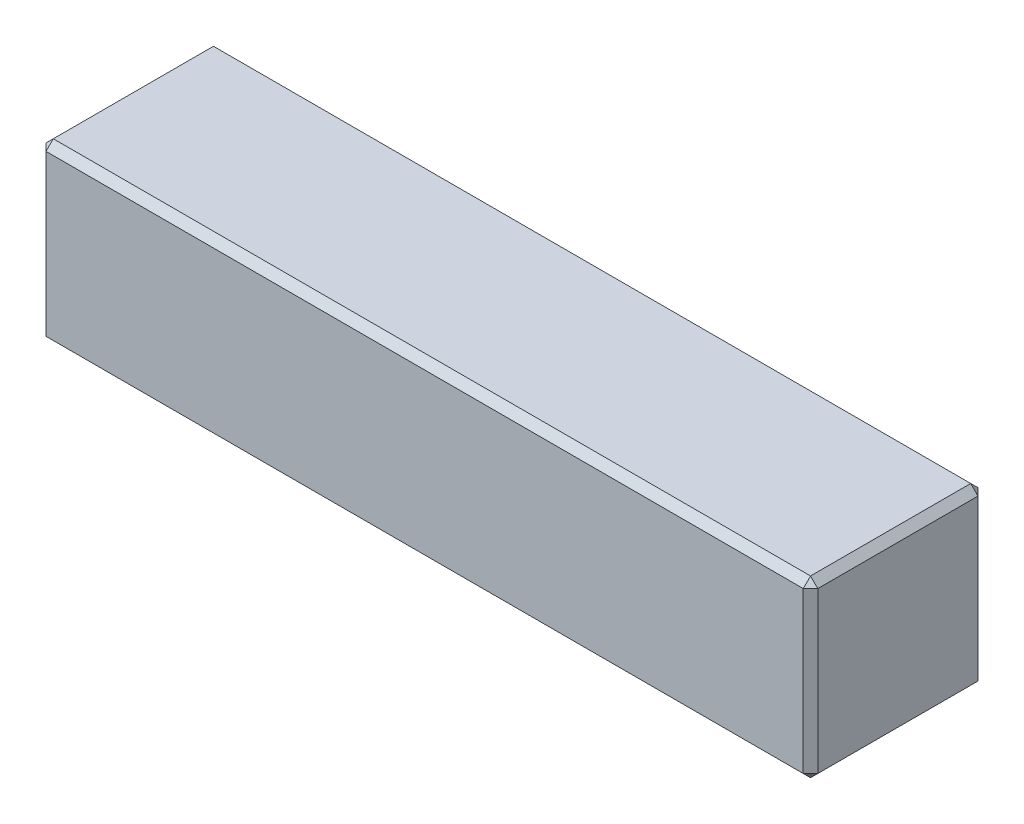
ISO-10303-21;
HEADER;
FILE_DESCRIPTION(('STEP AP214'),'2;1');
FILE_NAME('part.step','',(''),(''),'','','');
FILE_SCHEMA(('AUTOMOTIVE_DESIGN { 1 0 10303 214 1 1 1 1 }'));
ENDSEC;
DATA;
#1=APPLICATION_CONTEXT('core data for automotive mechanical design processes');
#2=APPLICATION_PROTOCOL_DEFINITION('international standard','automotive_design',2000,#1);
#3=PRODUCT_CONTEXT('',#1,'mechanical');
#4=PRODUCT('Part','Part','',(#3));
#5=PRODUCT_RELATED_PRODUCT_CATEGORY('part','',(#4));
#6=PRODUCT_DEFINITION_FORMATION('','',#4);
#7=PRODUCT_DEFINITION_CONTEXT('part definition',#1,'design');
#8=PRODUCT_DEFINITION('design','',#6,#7);
#9=PRODUCT_DEFINITION_SHAPE('','',#8);
#10=(LENGTH_UNIT() NAMED_UNIT(*) SI_UNIT(.MILLI.,.METRE.));
#11=(NAMED_UNIT(*) PLANE_ANGLE_UNIT() SI_UNIT($,.RADIAN.));
#12=(NAMED_UNIT(*) SI_UNIT($,.STERADIAN.) SOLID_ANGLE_UNIT());
#13=UNCERTAINTY_MEASURE_WITH_UNIT(LENGTH_MEASURE(1.E-05),#10,'distance_accuracy_value','');
#14=(GEOMETRIC_REPRESENTATION_CONTEXT(3) GLOBAL_UNCERTAINTY_ASSIGNED_CONTEXT((#13)) GLOBAL_UNIT_ASSIGNED_CONTEXT((#10,
#11,#12)) REPRESENTATION_CONTEXT('',''));
#15=CARTESIAN_POINT('',(0.,0.,0.));
#16=DIRECTION('',(0.,0.,1.));
#17=DIRECTION('',(1.,0.,0.));
#18=AXIS2_PLACEMENT_3D('',#15,#16,#17);
#19=CARTESIAN_POINT('',(26.5,-6.,-12.));
#20=DIRECTION('',(-1.,0.,0.));
#21=DIRECTION('',(0.,0.,1.));
#22=AXIS2_PLACEMENT_3D('',#19,#20,#21);
#23=PLANE('',#22);
#24=DIRECTION('',(0.,1.,0.));
#25=VECTOR('',#24,1.);
#26=CARTESIAN_POINT('',(26.5,-6.,-11.5));
#27=LINE('',#26,#25);
#28=CARTESIAN_POINT('',(26.5,-5.5,-11.5));
#29=VERTEX_POINT('',#28);
#30=CARTESIAN_POINT('',(26.5,5.5,-11.5));
#31=VERTEX_POINT('',#30);
#32=EDGE_CURVE('E140',#29,#31,#27,.T.);
#33=ORIENTED_EDGE('',*,*,#32,.T.);
#34=DIRECTION('',(0.,0.,1.));
#35=VECTOR('',#34,1.);
#36=CARTESIAN_POINT('',(26.5,5.5,-12.));
#37=LINE('',#36,#35);
#38=CARTESIAN_POINT('',(26.5,5.5,-0.5));
#39=VERTEX_POINT('',#38);
#40=EDGE_CURVE('E113',#31,#39,#37,.T.);
#41=ORIENTED_EDGE('',*,*,#40,.T.);
#42=DIRECTION('',(0.,-1.,0.));
#43=VECTOR('',#42,1.);
#44=CARTESIAN_POINT('',(26.5,-6.,-0.5));
#45=LINE('',#44,#43);
#46=CARTESIAN_POINT('',(26.5,-5.5,-0.5));
#47=VERTEX_POINT('',#46);
#48=EDGE_CURVE('E131',#39,#47,#45,.T.);
#49=ORIENTED_EDGE('',*,*,#48,.T.);
#50=DIRECTION('',(0.,0.,-1.));
#51=VECTOR('',#50,1.);
#52=CARTESIAN_POINT('',(26.5,-5.5,-12.));
#53=LINE('',#52,#51);
#54=EDGE_CURVE('E137',#47,#29,#53,.T.);
#55=ORIENTED_EDGE('',*,*,#54,.T.);
#56=EDGE_LOOP('',(#33,#41,#49,#55));
#57=FACE_BOUND('',#56,.T.);
#58=ADVANCED_FACE('F16',(#57),#23,.F.);
#59=CARTESIAN_POINT('',(26.5,-6.,-12.));
#60=DIRECTION('',(0.,1.,0.));
#61=DIRECTION('',(0.,0.,1.));
#62=AXIS2_PLACEMENT_3D('',#59,#60,#61);
#63=PLANE('',#62);
#64=DIRECTION('',(-1.,0.,0.));
#65=VECTOR('',#64,1.);
#66=CARTESIAN_POINT('',(-26.5,-6.,-0.5));
#67=LINE('',#66,#65);
#68=CARTESIAN_POINT('',(26.,-6.,-0.5));
#69=VERTEX_POINT('',#68);
#70=CARTESIAN_POINT('',(-26.,-6.,-0.5));
#71=VERTEX_POINT('',#70);
#72=EDGE_CURVE('E162',#69,#71,#67,.T.);
#73=ORIENTED_EDGE('',*,*,#72,.T.);
#74=DIRECTION('',(0.,0.,-1.));
#75=VECTOR('',#74,1.);
#76=CARTESIAN_POINT('',(-26.,-6.,-12.));
#77=LINE('',#76,#75);
#78=CARTESIAN_POINT('',(-26.,-6.,-11.5));
#79=VERTEX_POINT('',#78);
#80=EDGE_CURVE('E168',#71,#79,#77,.T.);
#81=ORIENTED_EDGE('',*,*,#80,.T.);
#82=DIRECTION('',(1.,0.,0.));
#83=VECTOR('',#82,1.);
#84=CARTESIAN_POINT('',(26.5,-6.,-11.5));
#85=LINE('',#84,#83);
#86=CARTESIAN_POINT('',(26.,-6.,-11.5));
#87=VERTEX_POINT('',#86);
#88=EDGE_CURVE('E166',#79,#87,#85,.T.);
#89=ORIENTED_EDGE('',*,*,#88,.T.);
#90=DIRECTION('',(0.,0.,1.));
#91=VECTOR('',#90,1.);
#92=CARTESIAN_POINT('',(26.,-6.,-12.));
#93=LINE('',#92,#91);
#94=EDGE_CURVE('E164',#87,#69,#93,.T.);
#95=ORIENTED_EDGE('',*,*,#94,.T.);
#96=EDGE_LOOP('',(#73,#81,#89,#95));
#97=FACE_BOUND('',#96,.T.);
#98=ADVANCED_FACE('F262',(#97),#63,.F.);
#99=CARTESIAN_POINT('',(-26.5,-6.,-12.));
#100=DIRECTION('',(1.,0.,0.));
#101=DIRECTION('',(0.,1.,0.));
#102=AXIS2_PLACEMENT_3D('',#99,#100,#101);
#103=PLANE('',#102);
#104=DIRECTION('',(0.,0.,-1.));
#105=VECTOR('',#104,1.);
#106=CARTESIAN_POINT('',(-26.5,5.5,-12.));
#107=LINE('',#106,#105);
#108=CARTESIAN_POINT('',(-26.5,5.5,-0.5));
#109=VERTEX_POINT('',#108);
#110=CARTESIAN_POINT('',(-26.5,5.5,-11.5));
#111=VERTEX_POINT('',#110);
#112=EDGE_CURVE('E157',#109,#111,#107,.T.);
#113=ORIENTED_EDGE('',*,*,#112,.T.);
#114=DIRECTION('',(0.,-1.,0.));
#115=VECTOR('',#114,1.);
#116=CARTESIAN_POINT('',(-26.5,-6.,-11.5));
#117=LINE('',#116,#115);
#118=CARTESIAN_POINT('',(-26.5,-5.5,-11.5));
#119=VERTEX_POINT('',#118);
#120=EDGE_CURVE('E160',#111,#119,#117,.T.);
#121=ORIENTED_EDGE('',*,*,#120,.T.);
#122=DIRECTION('',(0.,0.,1.));
#123=VECTOR('',#122,1.);
#124=CARTESIAN_POINT('',(-26.5,-5.5,-12.));
#125=LINE('',#124,#123);
#126=CARTESIAN_POINT('',(-26.5,-5.5,-0.5));
#127=VERTEX_POINT('',#126);
#128=EDGE_CURVE('E155',#119,#127,#125,.T.);
#129=ORIENTED_EDGE('',*,*,#128,.T.);
#130=DIRECTION('',(0.,1.,0.));
#131=VECTOR('',#130,1.);
#132=CARTESIAN_POINT('',(-26.5,6.,-0.5));
#133=LINE('',#132,#131);
#134=EDGE_CURVE('E153',#127,#109,#133,.T.);
#135=ORIENTED_EDGE('',*,*,#134,.T.);
#136=EDGE_LOOP('',(#113,#121,#129,#135));
#137=FACE_BOUND('',#136,.T.);
#138=ADVANCED_FACE('F282',(#137),#103,.F.);
#139=CARTESIAN_POINT('',(26.5,6.,-12.));
#140=DIRECTION('',(0.,-1.,0.));
#141=DIRECTION('',(0.,0.,-1.));
#142=AXIS2_PLACEMENT_3D('',#139,#140,#141);
#143=PLANE('',#142);
#144=DIRECTION('',(0.,0.,-1.));
#145=VECTOR('',#144,1.);
#146=CARTESIAN_POINT('',(26.,6.,-12.));
#147=LINE('',#146,#145);
#148=CARTESIAN_POINT('',(26.,6.,-0.5));
#149=VERTEX_POINT('',#148);
#150=CARTESIAN_POINT('',(26.,6.,-11.5));
#151=VERTEX_POINT('',#150);
#152=EDGE_CURVE('E115',#149,#151,#147,.T.);
#153=ORIENTED_EDGE('',*,*,#152,.T.);
#154=DIRECTION('',(-1.,0.,0.));
#155=VECTOR('',#154,1.);
#156=CARTESIAN_POINT('',(26.5,6.,-11.5));
#157=LINE('',#156,#155);
#158=CARTESIAN_POINT('',(-26.,6.,-11.5));
#159=VERTEX_POINT('',#158);
#160=EDGE_CURVE('E151',#151,#159,#157,.T.);
#161=ORIENTED_EDGE('',*,*,#160,.T.);
#162=DIRECTION('',(0.,0.,1.));
#163=VECTOR('',#162,1.);
#164=CARTESIAN_POINT('',(-26.,6.,-12.));
#165=LINE('',#164,#163);
#166=CARTESIAN_POINT('',(-26.,6.,-0.5));
#167=VERTEX_POINT('',#166);
#168=EDGE_CURVE('E144',#159,#167,#165,.T.);
#169=ORIENTED_EDGE('',*,*,#168,.T.);
#170=DIRECTION('',(1.,0.,0.));
#171=VECTOR('',#170,1.);
#172=CARTESIAN_POINT('',(26.5,6.,-0.5));
#173=LINE('',#172,#171);
#174=EDGE_CURVE('E142',#167,#149,#173,.T.);
#175=ORIENTED_EDGE('',*,*,#174,.T.);
#176=EDGE_LOOP('',(#153,#161,#169,#175));
#177=FACE_BOUND('',#176,.T.);
#178=ADVANCED_FACE('F339',(#177),#143,.F.);
#179=CARTESIAN_POINT('',(26.5,6.,-12.));
#180=DIRECTION('',(0.,0.,1.));
#181=DIRECTION('',(1.,0.,0.));
#182=AXIS2_PLACEMENT_3D('',#179,#180,#181);
#183=PLANE('',#182);
#184=DIRECTION('',(0.,1.,0.));
#185=VECTOR('',#184,1.);
#186=CARTESIAN_POINT('',(-26.,6.00000000000002,-12.));
#187=LINE('',#186,#185);
#188=CARTESIAN_POINT('',(-26.,-5.5,-12.));
#189=VERTEX_POINT('',#188);
#190=CARTESIAN_POINT('',(-26.,5.5,-12.));
#191=VERTEX_POINT('',#190);
#192=EDGE_CURVE('E175',#189,#191,#187,.T.);
#193=ORIENTED_EDGE('',*,*,#192,.T.);
#194=DIRECTION('',(1.,0.,0.));
#195=VECTOR('',#194,1.);
#196=CARTESIAN_POINT('',(26.5,5.5,-12.));
#197=LINE('',#196,#195);
#198=CARTESIAN_POINT('',(26.,5.5,-12.));
#199=VERTEX_POINT('',#198);
#200=EDGE_CURVE('E177',#191,#199,#197,.T.);
#201=ORIENTED_EDGE('',*,*,#200,.T.);
#202=DIRECTION('',(0.,-1.,0.));
#203=VECTOR('',#202,1.);
#204=CARTESIAN_POINT('',(26.,6.,-12.));
#205=LINE('',#204,#203);
#206=CARTESIAN_POINT('',(26.,-5.5,-12.));
#207=VERTEX_POINT('',#206);
#208=EDGE_CURVE('E171',#199,#207,#205,.T.);
#209=ORIENTED_EDGE('',*,*,#208,.T.);
#210=DIRECTION('',(-1.,0.,0.));
#211=VECTOR('',#210,1.);
#212=CARTESIAN_POINT('',(26.5,-5.5,-12.));
#213=LINE('',#212,#211);
#214=EDGE_CURVE('E173',#207,#189,#213,.T.);
#215=ORIENTED_EDGE('',*,*,#214,.T.);
#216=EDGE_LOOP('',(#193,#201,#209,#215));
#217=FACE_BOUND('',#216,.T.);
#218=ADVANCED_FACE('F253',(#217),#183,.F.);
#219=CARTESIAN_POINT('',(26.5,6.,0.));
#220=DIRECTION('',(0.,0.,1.));
#221=DIRECTION('',(1.,0.,0.));
#222=AXIS2_PLACEMENT_3D('',#219,#220,#221);
#223=PLANE('',#222);
#224=DIRECTION('',(0.,1.,0.));
#225=VECTOR('',#224,1.);
#226=CARTESIAN_POINT('',(26.,6.,0.));
#227=LINE('',#226,#225);
#228=CARTESIAN_POINT('',(26.,-5.5,0.));
#229=VERTEX_POINT('',#228);
#230=CARTESIAN_POINT('',(26.,5.5,0.));
#231=VERTEX_POINT('',#230);
#232=EDGE_CURVE('E180',#229,#231,#227,.T.);
#233=ORIENTED_EDGE('',*,*,#232,.T.);
#234=DIRECTION('',(-1.,0.,0.));
#235=VECTOR('',#234,1.);
#236=CARTESIAN_POINT('',(-26.5,5.5,0.));
#237=LINE('',#236,#235);
#238=CARTESIAN_POINT('',(-26.,5.5,0.));
#239=VERTEX_POINT('',#238);
#240=EDGE_CURVE('E10',#231,#239,#237,.T.);
#241=ORIENTED_EDGE('',*,*,#240,.T.);
#242=DIRECTION('',(0.,-1.,0.));
#243=VECTOR('',#242,1.);
#244=CARTESIAN_POINT('',(-26.,-6.,0.));
#245=LINE('',#244,#243);
#246=CARTESIAN_POINT('',(-26.,-5.5,0.));
#247=VERTEX_POINT('',#246);
#248=EDGE_CURVE('E25',#239,#247,#245,.T.);
#249=ORIENTED_EDGE('',*,*,#248,.T.);
#250=DIRECTION('',(1.,0.,0.));
#251=VECTOR('',#250,1.);
#252=CARTESIAN_POINT('',(26.5,-5.5,0.));
#253=LINE('',#252,#251);
#254=EDGE_CURVE('E182',#247,#229,#253,.T.);
#255=ORIENTED_EDGE('',*,*,#254,.T.);
#256=EDGE_LOOP('',(#233,#241,#249,#255));
#257=FACE_BOUND('',#256,.T.);
#258=ADVANCED_FACE('F346',(#257),#223,.T.);
#259=CARTESIAN_POINT('',(-26.5,-5.5,-12.));
#260=DIRECTION('',(0.70710678118655,0.707106781186545,0.));
#261=DIRECTION('',(0.,0.,1.));
#262=AXIS2_PLACEMENT_3D('',#259,#260,#261);
#263=PLANE('',#262);
#264=DIRECTION('',(0.707106781186545,-0.70710678118655,0.));
#265=VECTOR('',#264,1.);
#266=CARTESIAN_POINT('',(-26.,-6.,-11.5));
#267=LINE('',#266,#265);
#268=EDGE_CURVE('E20',#79,#119,#267,.F.);
#269=ORIENTED_EDGE('',*,*,#268,.F.);
#270=ORIENTED_EDGE('',*,*,#80,.F.);
#271=DIRECTION('',(-0.707106781186545,0.70710678118655,0.));
#272=VECTOR('',#271,1.);
#273=CARTESIAN_POINT('',(-26.5,-5.5,-0.5));
#274=LINE('',#273,#272);
#275=EDGE_CURVE('E231',#127,#71,#274,.F.);
#276=ORIENTED_EDGE('',*,*,#275,.F.);
#277=ORIENTED_EDGE('',*,*,#128,.F.);
#278=EDGE_LOOP('',(#269,#270,#276,#277));
#279=FACE_BOUND('',#278,.T.);
#280=ADVANCED_FACE('F18',(#279),#263,.F.);
#281=CARTESIAN_POINT('',(-26.,-6.,-11.5));
#282=DIRECTION('',(-0.577350269189624,-0.57735026918962,-0.577350269189632));
#283=DIRECTION('',(-0.707106781186552,0.,0.707106781186543));
#284=AXIS2_PLACEMENT_3D('',#281,#282,#283);
#285=PLANE('',#284);
#286=DIRECTION('',(0.,0.707106781186547,-0.707106781186547));
#287=VECTOR('',#286,1.);
#288=CARTESIAN_POINT('',(-26.,-6.,-11.5));
#289=LINE('',#288,#287);
#290=EDGE_CURVE('E226',#79,#189,#289,.T.);
#291=ORIENTED_EDGE('',*,*,#290,.F.);
#292=ORIENTED_EDGE('',*,*,#268,.T.);
#293=DIRECTION('',(-0.707106781186552,0.,0.707106781186542));
#294=VECTOR('',#293,1.);
#295=CARTESIAN_POINT('',(-26.25,-5.5,-11.75));
#296=LINE('',#295,#294);
#297=EDGE_CURVE('E229',#189,#119,#296,.T.);
#298=ORIENTED_EDGE('',*,*,#297,.F.);
#299=EDGE_LOOP('',(#291,#292,#298));
#300=FACE_BOUND('',#299,.T.);
#301=ADVANCED_FACE('F242',(#300),#285,.T.);
#302=CARTESIAN_POINT('',(-26.5,-5.5,-0.5));
#303=DIRECTION('',(-0.577350269189624,-0.57735026918962,0.577350269189632));
#304=DIRECTION('',(0.707106781186552,0.,0.707106781186543));
#305=AXIS2_PLACEMENT_3D('',#302,#303,#304);
#306=PLANE('',#305);
#307=DIRECTION('',(-0.707106781186552,0.,-0.707106781186542));
#308=VECTOR('',#307,1.);
#309=CARTESIAN_POINT('',(-26.5,-5.5,-0.500000000000001));
#310=LINE('',#309,#308);
#311=EDGE_CURVE('E221',#127,#247,#310,.F.);
#312=ORIENTED_EDGE('',*,*,#311,.F.);
#313=ORIENTED_EDGE('',*,*,#275,.T.);
#314=DIRECTION('',(0.,0.707106781186547,0.707106781186547));
#315=VECTOR('',#314,1.);
#316=CARTESIAN_POINT('',(-26.,-5.75,-0.250000000000005));
#317=LINE('',#316,#315);
#318=EDGE_CURVE('E223',#247,#71,#317,.F.);
#319=ORIENTED_EDGE('',*,*,#318,.F.);
#320=EDGE_LOOP('',(#312,#313,#319));
#321=FACE_BOUND('',#320,.T.);
#322=ADVANCED_FACE('F276',(#321),#306,.T.);
#323=CARTESIAN_POINT('',(-26.,6.00000000000002,-12.));
#324=DIRECTION('',(0.707106781186542,0.,0.707106781186552));
#325=DIRECTION('',(0.,1.,0.));
#326=AXIS2_PLACEMENT_3D('',#323,#324,#325);
#327=PLANE('',#326);
#328=ORIENTED_EDGE('',*,*,#297,.T.);
#329=ORIENTED_EDGE('',*,*,#120,.F.);
#330=DIRECTION('',(0.707106781186552,0.,-0.707106781186543));
#331=VECTOR('',#330,1.);
#332=CARTESIAN_POINT('',(-26.5,5.5,-11.5));
#333=LINE('',#332,#331);
#334=EDGE_CURVE('E216',#191,#111,#333,.F.);
#335=ORIENTED_EDGE('',*,*,#334,.F.);
#336=ORIENTED_EDGE('',*,*,#192,.F.);
#337=EDGE_LOOP('',(#328,#329,#335,#336));
#338=FACE_BOUND('',#337,.T.);
#339=ADVANCED_FACE('F249',(#338),#327,.F.);
#340=CARTESIAN_POINT('',(26.5,-5.5,-12.));
#341=DIRECTION('',(0.,0.707106781186547,0.707106781186547));
#342=DIRECTION('',(-1.,0.,0.));
#343=AXIS2_PLACEMENT_3D('',#340,#341,#342);
#344=PLANE('',#343);
#345=ORIENTED_EDGE('',*,*,#290,.T.);
#346=ORIENTED_EDGE('',*,*,#214,.F.);
#347=DIRECTION('',(0.,-0.707106781186547,0.707106781186547));
#348=VECTOR('',#347,1.);
#349=CARTESIAN_POINT('',(26.,-6.,-11.5));
#350=LINE('',#349,#348);
#351=EDGE_CURVE('E213',#87,#207,#350,.F.);
#352=ORIENTED_EDGE('',*,*,#351,.F.);
#353=ORIENTED_EDGE('',*,*,#88,.F.);
#354=EDGE_LOOP('',(#345,#346,#352,#353));
#355=FACE_BOUND('',#354,.T.);
#356=ADVANCED_FACE('F259',(#355),#344,.F.);
#357=CARTESIAN_POINT('',(26.,-6.,-12.));
#358=DIRECTION('',(-0.707106781186547,0.707106781186547,0.));
#359=DIRECTION('',(0.,0.,1.));
#360=AXIS2_PLACEMENT_3D('',#357,#358,#359);
#361=PLANE('',#360);
#362=DIRECTION('',(-0.707106781186547,-0.707106781186547,0.));
#363=VECTOR('',#362,1.);
#364=CARTESIAN_POINT('',(26.,-6.,-0.5));
#365=LINE('',#364,#363);
#366=EDGE_CURVE('E207',#69,#47,#365,.F.);
#367=ORIENTED_EDGE('',*,*,#366,.F.);
#368=ORIENTED_EDGE('',*,*,#94,.F.);
#369=DIRECTION('',(0.707106781186547,0.707106781186547,0.));
#370=VECTOR('',#369,1.);
#371=CARTESIAN_POINT('',(26.,-6.,-11.5));
#372=LINE('',#371,#370);
#373=EDGE_CURVE('E210',#29,#87,#372,.F.);
#374=ORIENTED_EDGE('',*,*,#373,.F.);
#375=ORIENTED_EDGE('',*,*,#54,.F.);
#376=EDGE_LOOP('',(#367,#368,#374,#375));
#377=FACE_BOUND('',#376,.T.);
#378=ADVANCED_FACE('F267',(#377),#361,.F.);
#379=CARTESIAN_POINT('',(26.5,-6.,-0.5));
#380=DIRECTION('',(0.,-0.707106781186547,0.707106781186547));
#381=DIRECTION('',(1.,0.,0.));
#382=AXIS2_PLACEMENT_3D('',#379,#380,#381);
#383=PLANE('',#382);
#384=ORIENTED_EDGE('',*,*,#318,.T.);
#385=ORIENTED_EDGE('',*,*,#72,.F.);
#386=DIRECTION('',(0.,-0.707106781186547,-0.707106781186547));
#387=VECTOR('',#386,1.);
#388=CARTESIAN_POINT('',(26.,-6.,-0.5));
#389=LINE('',#388,#387);
#390=EDGE_CURVE('E204',#229,#69,#389,.T.);
#391=ORIENTED_EDGE('',*,*,#390,.F.);
#392=ORIENTED_EDGE('',*,*,#254,.F.);
#393=EDGE_LOOP('',(#384,#385,#391,#392));
#394=FACE_BOUND('',#393,.T.);
#395=ADVANCED_FACE('F274',(#394),#383,.T.);
#396=CARTESIAN_POINT('',(-26.5,-6.,-0.5));
#397=DIRECTION('',(-0.707106781186542,0.,0.707106781186552));
#398=DIRECTION('',(0.,-1.,0.));
#399=AXIS2_PLACEMENT_3D('',#396,#397,#398);
#400=PLANE('',#399);
#401=ORIENTED_EDGE('',*,*,#311,.T.);
#402=ORIENTED_EDGE('',*,*,#248,.F.);
#403=DIRECTION('',(0.707106781186552,0.,0.707106781186543));
#404=VECTOR('',#403,1.);
#405=CARTESIAN_POINT('',(-26.25,5.5,-0.250000000000004));
#406=LINE('',#405,#404);
#407=EDGE_CURVE('E202',#109,#239,#406,.T.);
#408=ORIENTED_EDGE('',*,*,#407,.F.);
#409=ORIENTED_EDGE('',*,*,#134,.F.);
#410=EDGE_LOOP('',(#401,#402,#408,#409));
#411=FACE_BOUND('',#410,.T.);
#412=ADVANCED_FACE('F279',(#411),#400,.T.);
#413=CARTESIAN_POINT('',(-26.,6.,-12.));
#414=DIRECTION('',(0.707106781186552,-0.707106781186543,0.));
#415=DIRECTION('',(0.,0.,1.));
#416=AXIS2_PLACEMENT_3D('',#413,#414,#415);
#417=PLANE('',#416);
#418=DIRECTION('',(-0.707106781186543,-0.707106781186552,0.));
#419=VECTOR('',#418,1.);
#420=CARTESIAN_POINT('',(-26.5,5.5,-11.5));
#421=LINE('',#420,#419);
#422=EDGE_CURVE('E218',#111,#159,#421,.F.);
#423=ORIENTED_EDGE('',*,*,#422,.F.);
#424=ORIENTED_EDGE('',*,*,#112,.F.);
#425=DIRECTION('',(0.707106781186543,0.707106781186552,0.));
#426=VECTOR('',#425,1.);
#427=CARTESIAN_POINT('',(-26.,6.,-0.5));
#428=LINE('',#427,#426);
#429=EDGE_CURVE('E199',#167,#109,#428,.F.);
#430=ORIENTED_EDGE('',*,*,#429,.F.);
#431=ORIENTED_EDGE('',*,*,#168,.F.);
#432=EDGE_LOOP('',(#423,#424,#430,#431));
#433=FACE_BOUND('',#432,.T.);
#434=ADVANCED_FACE('F286',(#433),#417,.F.);
#435=CARTESIAN_POINT('',(-26.5,5.5,-11.5));
#436=DIRECTION('',(-0.577350269189626,0.577350269189618,-0.577350269189634));
#437=DIRECTION('',(-0.707106781186552,0.,0.707106781186543));
#438=AXIS2_PLACEMENT_3D('',#435,#436,#437);
#439=PLANE('',#438);
#440=ORIENTED_EDGE('',*,*,#334,.T.);
#441=ORIENTED_EDGE('',*,*,#422,.T.);
#442=DIRECTION('',(0.,0.707106781186548,0.707106781186548));
#443=VECTOR('',#442,1.);
#444=CARTESIAN_POINT('',(-26.,5.75000000000001,-11.75));
#445=LINE('',#444,#443);
#446=EDGE_CURVE('E196',#191,#159,#445,.T.);
#447=ORIENTED_EDGE('',*,*,#446,.F.);
#448=EDGE_LOOP('',(#440,#441,#447));
#449=FACE_BOUND('',#448,.T.);
#450=ADVANCED_FACE('F289',(#449),#439,.T.);
#451=CARTESIAN_POINT('',(26.,-6.,-11.5));
#452=DIRECTION('',(0.577350269189626,-0.577350269189626,-0.577350269189626));
#453=DIRECTION('',(-0.707106781186547,0.,-0.707106781186547));
#454=AXIS2_PLACEMENT_3D('',#451,#452,#453);
#455=PLANE('',#454);
#456=ORIENTED_EDGE('',*,*,#373,.T.);
#457=ORIENTED_EDGE('',*,*,#351,.T.);
#458=DIRECTION('',(-0.707106781186547,0.,-0.707106781186547));
#459=VECTOR('',#458,1.);
#460=CARTESIAN_POINT('',(26.25,-5.5,-11.75));
#461=LINE('',#460,#459);
#462=EDGE_CURVE('E193',#29,#207,#461,.T.);
#463=ORIENTED_EDGE('',*,*,#462,.F.);
#464=EDGE_LOOP('',(#456,#457,#463));
#465=FACE_BOUND('',#464,.T.);
#466=ADVANCED_FACE('F299',(#465),#455,.T.);
#467=CARTESIAN_POINT('',(26.,-6.,-0.5));
#468=DIRECTION('',(0.577350269189626,-0.577350269189626,0.577350269189626));
#469=DIRECTION('',(0.707106781186547,0.,-0.707106781186547));
#470=AXIS2_PLACEMENT_3D('',#467,#468,#469);
#471=PLANE('',#470);
#472=ORIENTED_EDGE('',*,*,#390,.T.);
#473=ORIENTED_EDGE('',*,*,#366,.T.);
#474=DIRECTION('',(-0.707106781186547,0.,0.707106781186547));
#475=VECTOR('',#474,1.);
#476=CARTESIAN_POINT('',(26.25,-5.5,-0.25));
#477=LINE('',#476,#475);
#478=EDGE_CURVE('E134',#229,#47,#477,.F.);
#479=ORIENTED_EDGE('',*,*,#478,.F.);
#480=EDGE_LOOP('',(#472,#473,#479));
#481=FACE_BOUND('',#480,.T.);
#482=ADVANCED_FACE('F271',(#481),#471,.T.);
#483=CARTESIAN_POINT('',(-26.,6.,-0.5));
#484=DIRECTION('',(-0.577350269189626,0.577350269189618,0.577350269189634));
#485=DIRECTION('',(0.707106781186552,0.,0.707106781186543));
#486=AXIS2_PLACEMENT_3D('',#483,#484,#485);
#487=PLANE('',#486);
#488=ORIENTED_EDGE('',*,*,#429,.T.);
#489=ORIENTED_EDGE('',*,*,#407,.T.);
#490=DIRECTION('',(0.,0.707106781186548,-0.707106781186548));
#491=VECTOR('',#490,1.);
#492=CARTESIAN_POINT('',(-26.,6.,-0.5));
#493=LINE('',#492,#491);
#494=EDGE_CURVE('E33',#167,#239,#493,.F.);
#495=ORIENTED_EDGE('',*,*,#494,.F.);
#496=EDGE_LOOP('',(#488,#489,#495));
#497=FACE_BOUND('',#496,.T.);
#498=ADVANCED_FACE('F307',(#497),#487,.T.);
#499=CARTESIAN_POINT('',(26.5,5.5,-12.));
#500=DIRECTION('',(0.,-0.707106781186547,0.707106781186547));
#501=DIRECTION('',(1.,0.,0.));
#502=AXIS2_PLACEMENT_3D('',#499,#500,#501);
#503=PLANE('',#502);
#504=ORIENTED_EDGE('',*,*,#446,.T.);
#505=ORIENTED_EDGE('',*,*,#160,.F.);
#506=DIRECTION('',(0.,-0.707106781186547,-0.707106781186547));
#507=VECTOR('',#506,1.);
#508=CARTESIAN_POINT('',(26.,6.,-11.5));
#509=LINE('',#508,#507);
#510=EDGE_CURVE('E188',#199,#151,#509,.F.);
#511=ORIENTED_EDGE('',*,*,#510,.F.);
#512=ORIENTED_EDGE('',*,*,#200,.F.);
#513=EDGE_LOOP('',(#504,#505,#511,#512));
#514=FACE_BOUND('',#513,.T.);
#515=ADVANCED_FACE('F292',(#514),#503,.F.);
#516=CARTESIAN_POINT('',(26.,6.,-12.));
#517=DIRECTION('',(-0.707106781186547,0.,0.707106781186547));
#518=DIRECTION('',(0.,-1.,0.));
#519=AXIS2_PLACEMENT_3D('',#516,#517,#518);
#520=PLANE('',#519);
#521=ORIENTED_EDGE('',*,*,#462,.T.);
#522=ORIENTED_EDGE('',*,*,#208,.F.);
#523=DIRECTION('',(0.707106781186547,0.,0.707106781186547));
#524=VECTOR('',#523,1.);
#525=CARTESIAN_POINT('',(26.25,5.5,-11.75));
#526=LINE('',#525,#524);
#527=EDGE_CURVE('E128',#31,#199,#526,.F.);
#528=ORIENTED_EDGE('',*,*,#527,.F.);
#529=ORIENTED_EDGE('',*,*,#32,.F.);
#530=EDGE_LOOP('',(#521,#522,#528,#529));
#531=FACE_BOUND('',#530,.T.);
#532=ADVANCED_FACE('F297',(#531),#520,.F.);
#533=CARTESIAN_POINT('',(26.5,-6.,-0.5));
#534=DIRECTION('',(0.707106781186547,0.,0.707106781186547));
#535=DIRECTION('',(0.,1.,0.));
#536=AXIS2_PLACEMENT_3D('',#533,#534,#535);
#537=PLANE('',#536);
#538=ORIENTED_EDGE('',*,*,#478,.T.);
#539=ORIENTED_EDGE('',*,*,#48,.F.);
#540=DIRECTION('',(0.707106781186547,0.,-0.707106781186547));
#541=VECTOR('',#540,1.);
#542=CARTESIAN_POINT('',(26.5,5.5,-0.5));
#543=LINE('',#542,#541);
#544=EDGE_CURVE('E121',#231,#39,#543,.T.);
#545=ORIENTED_EDGE('',*,*,#544,.F.);
#546=ORIENTED_EDGE('',*,*,#232,.F.);
#547=EDGE_LOOP('',(#538,#539,#545,#546));
#548=FACE_BOUND('',#547,.T.);
#549=ADVANCED_FACE('F132',(#548),#537,.T.);
#550=CARTESIAN_POINT('',(26.5,6.,-0.5));
#551=DIRECTION('',(0.,0.707106781186547,0.707106781186547));
#552=DIRECTION('',(-1.,0.,0.));
#553=AXIS2_PLACEMENT_3D('',#550,#551,#552);
#554=PLANE('',#553);
#555=ORIENTED_EDGE('',*,*,#494,.T.);
#556=ORIENTED_EDGE('',*,*,#240,.F.);
#557=DIRECTION('',(0.,-0.707106781186547,0.707106781186547));
#558=VECTOR('',#557,1.);
#559=CARTESIAN_POINT('',(26.,5.75,-0.25));
#560=LINE('',#559,#558);
#561=EDGE_CURVE('E125',#149,#231,#560,.T.);
#562=ORIENTED_EDGE('',*,*,#561,.F.);
#563=ORIENTED_EDGE('',*,*,#174,.F.);
#564=EDGE_LOOP('',(#555,#556,#562,#563));
#565=FACE_BOUND('',#564,.T.);
#566=ADVANCED_FACE('F325',(#565),#554,.T.);
#567=CARTESIAN_POINT('',(26.,6.,-11.5));
#568=DIRECTION('',(0.577350269189626,0.577350269189626,-0.577350269189626));
#569=DIRECTION('',(-0.707106781186547,0.,-0.707106781186547));
#570=AXIS2_PLACEMENT_3D('',#567,#568,#569);
#571=PLANE('',#570);
#572=ORIENTED_EDGE('',*,*,#527,.T.);
#573=ORIENTED_EDGE('',*,*,#510,.T.);
#574=DIRECTION('',(-0.707106781186547,0.707106781186547,0.));
#575=VECTOR('',#574,1.);
#576=CARTESIAN_POINT('',(26.,6.,-11.5));
#577=LINE('',#576,#575);
#578=EDGE_CURVE('E118',#31,#151,#577,.T.);
#579=ORIENTED_EDGE('',*,*,#578,.F.);
#580=EDGE_LOOP('',(#572,#573,#579));
#581=FACE_BOUND('',#580,.T.);
#582=ADVANCED_FACE('F322',(#581),#571,.T.);
#583=CARTESIAN_POINT('',(26.5,5.5,-0.5));
#584=DIRECTION('',(0.577350269189626,0.577350269189626,0.577350269189626));
#585=DIRECTION('',(0.707106781186547,0.,-0.707106781186547));
#586=AXIS2_PLACEMENT_3D('',#583,#584,#585);
#587=PLANE('',#586);
#588=ORIENTED_EDGE('',*,*,#561,.T.);
#589=ORIENTED_EDGE('',*,*,#544,.T.);
#590=DIRECTION('',(0.707106781186547,-0.707106781186547,0.));
#591=VECTOR('',#590,1.);
#592=CARTESIAN_POINT('',(26.5,5.5,-0.5));
#593=LINE('',#592,#591);
#594=EDGE_CURVE('E109',#149,#39,#593,.T.);
#595=ORIENTED_EDGE('',*,*,#594,.F.);
#596=EDGE_LOOP('',(#588,#589,#595));
#597=FACE_BOUND('',#596,.T.);
#598=ADVANCED_FACE('F123',(#597),#587,.T.);
#599=CARTESIAN_POINT('',(26.5,5.5,-12.));
#600=DIRECTION('',(-0.707106781186547,-0.707106781186547,0.));
#601=DIRECTION('',(0.,0.,1.));
#602=AXIS2_PLACEMENT_3D('',#599,#600,#601);
#603=PLANE('',#602);
#604=ORIENTED_EDGE('',*,*,#578,.T.);
#605=ORIENTED_EDGE('',*,*,#152,.F.);
#606=ORIENTED_EDGE('',*,*,#594,.T.);
#607=ORIENTED_EDGE('',*,*,#40,.F.);
#608=EDGE_LOOP('',(#604,#605,#606,#607));
#609=FACE_BOUND('',#608,.T.);
#610=ADVANCED_FACE('F111',(#609),#603,.F.);
#611=CLOSED_SHELL('',(#58,#98,#138,#178,#218,#258,#280,#301,#322,#339,#356,#378,#395,#412,#434,
#450,#466,#482,#498,#515,#532,#549,#566,#582,#598,#610));
#612=MANIFOLD_SOLID_BREP('B1',#611);
#613=ADVANCED_BREP_SHAPE_REPRESENTATION('',(#18,#612),#14);
#614=SHAPE_DEFINITION_REPRESENTATION(#9,#613);
ENDSEC;
END-ISO-10303-21;
